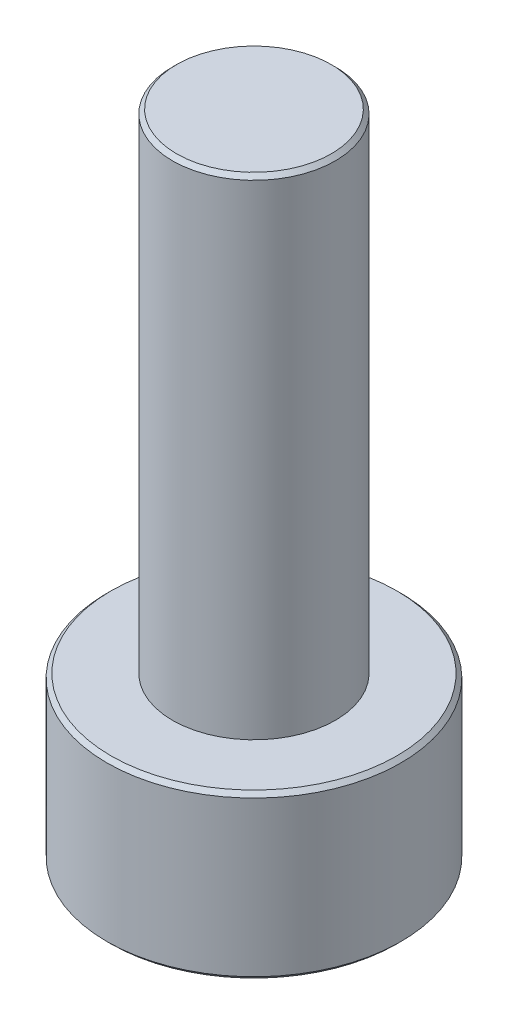
ISO-10303-21;
HEADER;
FILE_DESCRIPTION(('STEP AP214'),'2;1');
FILE_NAME('part.step','',(''),(''),'','','');
FILE_SCHEMA(('AUTOMOTIVE_DESIGN { 1 0 10303 214 1 1 1 1 }'));
ENDSEC;
DATA;
#1=APPLICATION_CONTEXT('core data for automotive mechanical design processes');
#2=APPLICATION_PROTOCOL_DEFINITION('international standard','automotive_design',2000,#1);
#3=PRODUCT_CONTEXT('',#1,'mechanical');
#4=PRODUCT('Part','Part','',(#3));
#5=PRODUCT_RELATED_PRODUCT_CATEGORY('part','',(#4));
#6=PRODUCT_DEFINITION_FORMATION('','',#4);
#7=PRODUCT_DEFINITION_CONTEXT('part definition',#1,'design');
#8=PRODUCT_DEFINITION('design','',#6,#7);
#9=PRODUCT_DEFINITION_SHAPE('','',#8);
#10=(LENGTH_UNIT() NAMED_UNIT(*) SI_UNIT(.MILLI.,.METRE.));
#11=(NAMED_UNIT(*) PLANE_ANGLE_UNIT() SI_UNIT($,.RADIAN.));
#12=(NAMED_UNIT(*) SI_UNIT($,.STERADIAN.) SOLID_ANGLE_UNIT());
#13=UNCERTAINTY_MEASURE_WITH_UNIT(LENGTH_MEASURE(1.E-05),#10,'distance_accuracy_value','');
#14=(GEOMETRIC_REPRESENTATION_CONTEXT(3) GLOBAL_UNCERTAINTY_ASSIGNED_CONTEXT((#13)) GLOBAL_UNIT_ASSIGNED_CONTEXT((#10,
#11,#12)) REPRESENTATION_CONTEXT('',''));
#15=CARTESIAN_POINT('',(0.,0.,0.));
#16=DIRECTION('',(0.,0.,1.));
#17=DIRECTION('',(1.,0.,0.));
#18=AXIS2_PLACEMENT_3D('',#15,#16,#17);
#19=CARTESIAN_POINT('',(0.,4.,0.));
#20=DIRECTION('',(0.,-1.,0.));
#21=DIRECTION('',(0.,0.,-1.));
#22=AXIS2_PLACEMENT_3D('',#19,#20,#21);
#23=CYLINDRICAL_SURFACE('',#22,3.61);
#24=CARTESIAN_POINT('',(0.,3.9,0.));
#25=DIRECTION('',(0.,1.,0.));
#26=DIRECTION('',(0.,0.,1.));
#27=AXIS2_PLACEMENT_3D('',#24,#25,#26);
#28=CIRCLE('',#27,3.61);
#29=CARTESIAN_POINT('',(0.,3.9,3.61));
#30=VERTEX_POINT('',#29);
#31=EDGE_CURVE('E44',#30,#30,#28,.F.);
#32=ORIENTED_EDGE('',*,*,#31,.T.);
#33=EDGE_LOOP('',(#32));
#34=FACE_BOUND('',#33,.T.);
#35=CARTESIAN_POINT('',(0.,0.0999999999999968,0.));
#36=DIRECTION('',(0.,1.,0.));
#37=DIRECTION('',(0.,0.,1.));
#38=AXIS2_PLACEMENT_3D('',#35,#36,#37);
#39=CIRCLE('',#38,3.61);
#40=CARTESIAN_POINT('',(0.,0.0999999999999968,3.61));
#41=VERTEX_POINT('',#40);
#42=EDGE_CURVE('E155',#41,#41,#39,.T.);
#43=ORIENTED_EDGE('',*,*,#42,.T.);
#44=EDGE_LOOP('',(#43));
#45=FACE_BOUND('',#44,.T.);
#46=ADVANCED_FACE('F36',(#34,#45),#23,.T.);
#47=CARTESIAN_POINT('',(0.,4.,0.));
#48=DIRECTION('',(0.,1.,0.));
#49=DIRECTION('',(0.,0.,1.));
#50=AXIS2_PLACEMENT_3D('',#47,#48,#49);
#51=PLANE('',#50);
#52=CARTESIAN_POINT('',(0.,4.,0.));
#53=DIRECTION('',(0.,1.,0.));
#54=DIRECTION('',(0.,0.,1.));
#55=AXIS2_PLACEMENT_3D('',#52,#53,#54);
#56=CIRCLE('',#55,3.51);
#57=CARTESIAN_POINT('',(0.,4.,3.51));
#58=VERTEX_POINT('',#57);
#59=EDGE_CURVE('E152',#58,#58,#56,.T.);
#60=ORIENTED_EDGE('',*,*,#59,.T.);
#61=EDGE_LOOP('',(#60));
#62=FACE_BOUND('',#61,.T.);
#63=CARTESIAN_POINT('',(0.,4.,0.));
#64=DIRECTION('',(0.,1.,0.));
#65=DIRECTION('',(0.,0.,1.));
#66=AXIS2_PLACEMENT_3D('',#63,#64,#65);
#67=CIRCLE('',#66,2.);
#68=CARTESIAN_POINT('',(0.,4.,2.));
#69=VERTEX_POINT('',#68);
#70=EDGE_CURVE('E138',#69,#69,#67,.T.);
#71=ORIENTED_EDGE('',*,*,#70,.F.);
#72=EDGE_LOOP('',(#71));
#73=FACE_BOUND('',#72,.T.);
#74=ADVANCED_FACE('F168',(#62,#73),#51,.T.);
#75=CARTESIAN_POINT('',(0.,0.,0.));
#76=DIRECTION('',(0.,1.,0.));
#77=DIRECTION('',(0.,0.,1.));
#78=AXIS2_PLACEMENT_3D('',#75,#76,#77);
#79=PLANE('',#78);
#80=CARTESIAN_POINT('',(0.,0.,0.));
#81=DIRECTION('',(0.,1.,0.));
#82=DIRECTION('',(0.,0.,1.));
#83=AXIS2_PLACEMENT_3D('',#80,#81,#82);
#84=CIRCLE('',#83,3.51);
#85=CARTESIAN_POINT('',(0.,0.,3.51));
#86=VERTEX_POINT('',#85);
#87=EDGE_CURVE('E11',#86,#86,#84,.F.);
#88=ORIENTED_EDGE('',*,*,#87,.T.);
#89=EDGE_LOOP('',(#88));
#90=FACE_BOUND('',#89,.T.);
#91=DIRECTION('',(0.,0.,1.));
#92=VECTOR('',#91,1.);
#93=CARTESIAN_POINT('',(1.54,0.,-0.889119414552024));
#94=LINE('',#93,#92);
#95=CARTESIAN_POINT('',(1.54,0.,-0.889119414552024));
#96=VERTEX_POINT('',#95);
#97=CARTESIAN_POINT('',(1.54,0.,0.889119414552024));
#98=VERTEX_POINT('',#97);
#99=EDGE_CURVE('E125',#96,#98,#94,.T.);
#100=ORIENTED_EDGE('',*,*,#99,.F.);
#101=DIRECTION('',(0.866025403784439,0.,0.5));
#102=VECTOR('',#101,1.);
#103=CARTESIAN_POINT('',(0.,0.,-1.77823882910405));
#104=LINE('',#103,#102);
#105=CARTESIAN_POINT('',(0.,0.,-1.77823882910405));
#106=VERTEX_POINT('',#105);
#107=EDGE_CURVE('E51',#106,#96,#104,.T.);
#108=ORIENTED_EDGE('',*,*,#107,.F.);
#109=DIRECTION('',(0.866025403784439,0.,-0.5));
#110=VECTOR('',#109,1.);
#111=CARTESIAN_POINT('',(-1.54,0.,-0.889119414552024));
#112=LINE('',#111,#110);
#113=CARTESIAN_POINT('',(-1.54,0.,-0.889119414552024));
#114=VERTEX_POINT('',#113);
#115=EDGE_CURVE('E134',#114,#106,#112,.T.);
#116=ORIENTED_EDGE('',*,*,#115,.F.);
#117=DIRECTION('',(0.,0.,-1.));
#118=VECTOR('',#117,1.);
#119=CARTESIAN_POINT('',(-1.54,0.,0.889119414552024));
#120=LINE('',#119,#118);
#121=CARTESIAN_POINT('',(-1.54,0.,0.889119414552024));
#122=VERTEX_POINT('',#121);
#123=EDGE_CURVE('E132',#122,#114,#120,.T.);
#124=ORIENTED_EDGE('',*,*,#123,.F.);
#125=DIRECTION('',(-0.866025403784439,0.,-0.5));
#126=VECTOR('',#125,1.);
#127=CARTESIAN_POINT('',(0.,0.,1.77823882910405));
#128=LINE('',#127,#126);
#129=CARTESIAN_POINT('',(0.,0.,1.77823882910405));
#130=VERTEX_POINT('',#129);
#131=EDGE_CURVE('E99',#130,#122,#128,.T.);
#132=ORIENTED_EDGE('',*,*,#131,.F.);
#133=DIRECTION('',(-0.866025403784439,0.,0.5));
#134=VECTOR('',#133,1.);
#135=CARTESIAN_POINT('',(1.54,0.,0.889119414552024));
#136=LINE('',#135,#134);
#137=EDGE_CURVE('E128',#98,#130,#136,.T.);
#138=ORIENTED_EDGE('',*,*,#137,.F.);
#139=EDGE_LOOP('',(#100,#108,#116,#124,#132,#138));
#140=FACE_BOUND('',#139,.T.);
#141=ADVANCED_FACE('F171',(#90,#140),#79,.F.);
#142=CARTESIAN_POINT('',(0.,16.,0.));
#143=DIRECTION('',(0.,-1.,0.));
#144=DIRECTION('',(0.,0.,-1.));
#145=AXIS2_PLACEMENT_3D('',#142,#143,#144);
#146=CYLINDRICAL_SURFACE('',#145,2.);
#147=CARTESIAN_POINT('',(0.,15.9,0.));
#148=DIRECTION('',(0.,1.,0.));
#149=DIRECTION('',(0.,0.,1.));
#150=AXIS2_PLACEMENT_3D('',#147,#148,#149);
#151=CIRCLE('',#150,2.);
#152=CARTESIAN_POINT('',(0.,15.9,2.));
#153=VERTEX_POINT('',#152);
#154=EDGE_CURVE('E149',#153,#153,#151,.F.);
#155=ORIENTED_EDGE('',*,*,#154,.T.);
#156=EDGE_LOOP('',(#155));
#157=FACE_BOUND('',#156,.T.);
#158=ORIENTED_EDGE('',*,*,#70,.T.);
#159=EDGE_LOOP('',(#158));
#160=FACE_BOUND('',#159,.T.);
#161=ADVANCED_FACE('F175',(#157,#160),#146,.T.);
#162=CARTESIAN_POINT('',(0.,16.,0.));
#163=DIRECTION('',(0.,1.,0.));
#164=DIRECTION('',(0.,0.,1.));
#165=AXIS2_PLACEMENT_3D('',#162,#163,#164);
#166=PLANE('',#165);
#167=CARTESIAN_POINT('',(0.,16.,0.));
#168=DIRECTION('',(0.,1.,0.));
#169=DIRECTION('',(0.,0.,1.));
#170=AXIS2_PLACEMENT_3D('',#167,#168,#169);
#171=CIRCLE('',#170,1.9);
#172=CARTESIAN_POINT('',(0.,16.,1.9));
#173=VERTEX_POINT('',#172);
#174=EDGE_CURVE('E146',#173,#173,#171,.T.);
#175=ORIENTED_EDGE('',*,*,#174,.T.);
#176=EDGE_LOOP('',(#175));
#177=FACE_BOUND('',#176,.T.);
#178=ADVANCED_FACE('F177',(#177),#166,.T.);
#179=CARTESIAN_POINT('',(0.,2.,-1.77823882910405));
#180=DIRECTION('',(0.5,0.,-0.866025403784439));
#181=DIRECTION('',(-0.866025403784439,0.,-0.5));
#182=AXIS2_PLACEMENT_3D('',#179,#180,#181);
#183=PLANE('',#182);
#184=ORIENTED_EDGE('',*,*,#107,.T.);
#185=DIRECTION('',(0.,-1.,0.));
#186=VECTOR('',#185,1.);
#187=CARTESIAN_POINT('',(1.54,2.,-0.889119414552024));
#188=LINE('',#187,#186);
#189=CARTESIAN_POINT('',(1.54,2.,-0.889119414552024));
#190=VERTEX_POINT('',#189);
#191=EDGE_CURVE('E81',#190,#96,#188,.T.);
#192=ORIENTED_EDGE('',*,*,#191,.F.);
#193=DIRECTION('',(0.866025403784439,0.,0.5));
#194=VECTOR('',#193,1.);
#195=CARTESIAN_POINT('',(0.,2.,-1.77823882910405));
#196=LINE('',#195,#194);
#197=CARTESIAN_POINT('',(0.,2.,-1.77823882910405));
#198=VERTEX_POINT('',#197);
#199=EDGE_CURVE('E136',#198,#190,#196,.T.);
#200=ORIENTED_EDGE('',*,*,#199,.F.);
#201=DIRECTION('',(0.,-1.,0.));
#202=VECTOR('',#201,1.);
#203=CARTESIAN_POINT('',(0.,2.,-1.77823882910405));
#204=LINE('',#203,#202);
#205=EDGE_CURVE('E59',#198,#106,#204,.T.);
#206=ORIENTED_EDGE('',*,*,#205,.T.);
#207=EDGE_LOOP('',(#184,#192,#200,#206));
#208=FACE_BOUND('',#207,.T.);
#209=ADVANCED_FACE('F184',(#208),#183,.F.);
#210=CARTESIAN_POINT('',(-1.54,2.,-0.889119414552024));
#211=DIRECTION('',(-0.5,0.,-0.866025403784439));
#212=DIRECTION('',(-0.866025403784439,0.,0.5));
#213=AXIS2_PLACEMENT_3D('',#210,#211,#212);
#214=PLANE('',#213);
#215=ORIENTED_EDGE('',*,*,#115,.T.);
#216=ORIENTED_EDGE('',*,*,#205,.F.);
#217=DIRECTION('',(0.866025403784439,0.,-0.5));
#218=VECTOR('',#217,1.);
#219=CARTESIAN_POINT('',(-1.54,2.,-0.889119414552024));
#220=LINE('',#219,#218);
#221=CARTESIAN_POINT('',(-1.54,2.,-0.889119414552024));
#222=VERTEX_POINT('',#221);
#223=EDGE_CURVE('E111',#222,#198,#220,.T.);
#224=ORIENTED_EDGE('',*,*,#223,.F.);
#225=DIRECTION('',(0.,-1.,0.));
#226=VECTOR('',#225,1.);
#227=CARTESIAN_POINT('',(-1.54,2.,-0.889119414552024));
#228=LINE('',#227,#226);
#229=EDGE_CURVE('E103',#222,#114,#228,.T.);
#230=ORIENTED_EDGE('',*,*,#229,.T.);
#231=EDGE_LOOP('',(#215,#216,#224,#230));
#232=FACE_BOUND('',#231,.T.);
#233=ADVANCED_FACE('F211',(#232),#214,.F.);
#234=CARTESIAN_POINT('',(-1.54,2.,0.889119414552024));
#235=DIRECTION('',(-1.,0.,0.));
#236=DIRECTION('',(0.,0.,1.));
#237=AXIS2_PLACEMENT_3D('',#234,#235,#236);
#238=PLANE('',#237);
#239=ORIENTED_EDGE('',*,*,#123,.T.);
#240=ORIENTED_EDGE('',*,*,#229,.F.);
#241=DIRECTION('',(0.,0.,-1.));
#242=VECTOR('',#241,1.);
#243=CARTESIAN_POINT('',(-1.54,2.,0.889119414552024));
#244=LINE('',#243,#242);
#245=CARTESIAN_POINT('',(-1.54,2.,0.889119414552024));
#246=VERTEX_POINT('',#245);
#247=EDGE_CURVE('E107',#246,#222,#244,.T.);
#248=ORIENTED_EDGE('',*,*,#247,.F.);
#249=DIRECTION('',(0.,-1.,0.));
#250=VECTOR('',#249,1.);
#251=CARTESIAN_POINT('',(-1.54,2.,0.889119414552024));
#252=LINE('',#251,#250);
#253=EDGE_CURVE('E92',#246,#122,#252,.T.);
#254=ORIENTED_EDGE('',*,*,#253,.T.);
#255=EDGE_LOOP('',(#239,#240,#248,#254));
#256=FACE_BOUND('',#255,.T.);
#257=ADVANCED_FACE('F108',(#256),#238,.F.);
#258=CARTESIAN_POINT('',(0.,2.,1.77823882910405));
#259=DIRECTION('',(-0.5,0.,0.866025403784439));
#260=DIRECTION('',(0.866025403784439,0.,0.5));
#261=AXIS2_PLACEMENT_3D('',#258,#259,#260);
#262=PLANE('',#261);
#263=ORIENTED_EDGE('',*,*,#131,.T.);
#264=ORIENTED_EDGE('',*,*,#253,.F.);
#265=DIRECTION('',(-0.866025403784439,0.,-0.5));
#266=VECTOR('',#265,1.);
#267=CARTESIAN_POINT('',(0.,2.,1.77823882910405));
#268=LINE('',#267,#266);
#269=CARTESIAN_POINT('',(0.,2.,1.77823882910405));
#270=VERTEX_POINT('',#269);
#271=EDGE_CURVE('E96',#270,#246,#268,.T.);
#272=ORIENTED_EDGE('',*,*,#271,.F.);
#273=DIRECTION('',(0.,-1.,0.));
#274=VECTOR('',#273,1.);
#275=CARTESIAN_POINT('',(0.,2.,1.77823882910405));
#276=LINE('',#275,#274);
#277=EDGE_CURVE('E104',#270,#130,#276,.T.);
#278=ORIENTED_EDGE('',*,*,#277,.T.);
#279=EDGE_LOOP('',(#263,#264,#272,#278));
#280=FACE_BOUND('',#279,.T.);
#281=ADVANCED_FACE('F94',(#280),#262,.F.);
#282=CARTESIAN_POINT('',(1.54,2.,0.889119414552024));
#283=DIRECTION('',(0.5,0.,0.866025403784439));
#284=DIRECTION('',(0.866025403784439,0.,-0.5));
#285=AXIS2_PLACEMENT_3D('',#282,#283,#284);
#286=PLANE('',#285);
#287=ORIENTED_EDGE('',*,*,#137,.T.);
#288=ORIENTED_EDGE('',*,*,#277,.F.);
#289=DIRECTION('',(-0.866025403784439,0.,0.5));
#290=VECTOR('',#289,1.);
#291=CARTESIAN_POINT('',(1.54,2.,0.889119414552024));
#292=LINE('',#291,#290);
#293=CARTESIAN_POINT('',(1.54,2.,0.889119414552024));
#294=VERTEX_POINT('',#293);
#295=EDGE_CURVE('E117',#294,#270,#292,.T.);
#296=ORIENTED_EDGE('',*,*,#295,.F.);
#297=DIRECTION('',(0.,-1.,0.));
#298=VECTOR('',#297,1.);
#299=CARTESIAN_POINT('',(1.54,2.,0.889119414552024));
#300=LINE('',#299,#298);
#301=EDGE_CURVE('E141',#294,#98,#300,.T.);
#302=ORIENTED_EDGE('',*,*,#301,.T.);
#303=EDGE_LOOP('',(#287,#288,#296,#302));
#304=FACE_BOUND('',#303,.T.);
#305=ADVANCED_FACE('F207',(#304),#286,.F.);
#306=CARTESIAN_POINT('',(1.54,2.,-0.889119414552024));
#307=DIRECTION('',(1.,0.,0.));
#308=DIRECTION('',(0.,0.,-1.));
#309=AXIS2_PLACEMENT_3D('',#306,#307,#308);
#310=PLANE('',#309);
#311=ORIENTED_EDGE('',*,*,#99,.T.);
#312=ORIENTED_EDGE('',*,*,#301,.F.);
#313=DIRECTION('',(0.,0.,1.));
#314=VECTOR('',#313,1.);
#315=CARTESIAN_POINT('',(1.54,2.,-0.889119414552024));
#316=LINE('',#315,#314);
#317=EDGE_CURVE('E119',#190,#294,#316,.T.);
#318=ORIENTED_EDGE('',*,*,#317,.F.);
#319=ORIENTED_EDGE('',*,*,#191,.T.);
#320=EDGE_LOOP('',(#311,#312,#318,#319));
#321=FACE_BOUND('',#320,.T.);
#322=ADVANCED_FACE('F199',(#321),#310,.F.);
#323=CARTESIAN_POINT('',(0.,2.,0.));
#324=DIRECTION('',(0.,-1.,0.));
#325=DIRECTION('',(0.,0.,-1.));
#326=AXIS2_PLACEMENT_3D('',#323,#324,#325);
#327=PLANE('',#326);
#328=ORIENTED_EDGE('',*,*,#199,.T.);
#329=ORIENTED_EDGE('',*,*,#317,.T.);
#330=ORIENTED_EDGE('',*,*,#295,.T.);
#331=ORIENTED_EDGE('',*,*,#271,.T.);
#332=ORIENTED_EDGE('',*,*,#247,.T.);
#333=ORIENTED_EDGE('',*,*,#223,.T.);
#334=EDGE_LOOP('',(#328,#329,#330,#331,#332,#333));
#335=FACE_BOUND('',#334,.T.);
#336=ADVANCED_FACE('F114',(#335),#327,.T.);
#337=CARTESIAN_POINT('',(0.,16.,0.));
#338=DIRECTION('',(0.,-1.,0.));
#339=DIRECTION('',(0.,0.,-1.));
#340=AXIS2_PLACEMENT_3D('',#337,#338,#339);
#341=CONICAL_SURFACE('',#340,1.9,0.785398163397457);
#342=ORIENTED_EDGE('',*,*,#154,.F.);
#343=EDGE_LOOP('',(#342));
#344=FACE_BOUND('',#343,.T.);
#345=ORIENTED_EDGE('',*,*,#174,.F.);
#346=EDGE_LOOP('',(#345));
#347=FACE_BOUND('',#346,.T.);
#348=ADVANCED_FACE('F165',(#344,#347),#341,.T.);
#349=CARTESIAN_POINT('',(0.,4.,0.));
#350=DIRECTION('',(0.,-1.,0.));
#351=DIRECTION('',(0.,0.,-1.));
#352=AXIS2_PLACEMENT_3D('',#349,#350,#351);
#353=CONICAL_SURFACE('',#352,3.51,0.785398163397448);
#354=ORIENTED_EDGE('',*,*,#31,.F.);
#355=EDGE_LOOP('',(#354));
#356=FACE_BOUND('',#355,.T.);
#357=ORIENTED_EDGE('',*,*,#59,.F.);
#358=EDGE_LOOP('',(#357));
#359=FACE_BOUND('',#358,.T.);
#360=ADVANCED_FACE('F162',(#356,#359),#353,.T.);
#361=CARTESIAN_POINT('',(0.,0.0999999999999968,0.));
#362=DIRECTION('',(0.,1.,0.));
#363=DIRECTION('',(0.,0.,1.));
#364=AXIS2_PLACEMENT_3D('',#361,#362,#363);
#365=CONICAL_SURFACE('',#364,3.61,0.785398163397459);
#366=CARTESIAN_POINT('',(0.,0.,3.51));
#367=CARTESIAN_POINT('',(0.,0.00104166666666651,3.51104166666667));
#368=CARTESIAN_POINT('',(0.,0.00208333333333318,3.51208333333333));
#369=CARTESIAN_POINT('',(0.,0.00416666666666652,3.51416666666667));
#370=CARTESIAN_POINT('',(0.,0.00520833333333319,3.51520833333333));
#371=CARTESIAN_POINT('',(0.,0.00729166666666646,3.51729166666667));
#372=CARTESIAN_POINT('',(0.,0.00833333333333306,3.51833333333333));
#373=CARTESIAN_POINT('',(0.,0.0104166666666663,3.52041666666667));
#374=CARTESIAN_POINT('',(0.,0.011458333333333,3.52145833333333));
#375=CARTESIAN_POINT('',(0.,0.0135416666666662,3.52354166666667));
#376=CARTESIAN_POINT('',(0.,0.0145833333333328,3.52458333333333));
#377=CARTESIAN_POINT('',(0.,0.0166666666666661,3.52666666666667));
#378=CARTESIAN_POINT('',(0.,0.0177083333333328,3.52770833333333));
#379=CARTESIAN_POINT('',(0.,0.0197916666666661,3.52979166666667));
#380=CARTESIAN_POINT('',(0.,0.0208333333333327,3.53083333333333));
#381=CARTESIAN_POINT('',(0.,0.0229166666666659,3.53291666666667));
#382=CARTESIAN_POINT('',(0.,0.0239583333333325,3.53395833333333));
#383=CARTESIAN_POINT('',(0.,0.0260416666666658,3.53604166666667));
#384=CARTESIAN_POINT('',(0.,0.0270833333333325,3.53708333333333));
#385=CARTESIAN_POINT('',(0.,0.0291666666666658,3.53916666666667));
#386=CARTESIAN_POINT('',(0.,0.0302083333333324,3.54020833333333));
#387=CARTESIAN_POINT('',(0.,0.0322916666666656,3.54229166666667));
#388=CARTESIAN_POINT('',(0.,0.0333333333333323,3.54333333333333));
#389=CARTESIAN_POINT('',(0.,0.0354166666666655,3.54541666666667));
#390=CARTESIAN_POINT('',(0.,0.0364583333333321,3.54645833333333));
#391=CARTESIAN_POINT('',(0.,0.0385416666666654,3.54854166666667));
#392=CARTESIAN_POINT('',(0.,0.0395833333333321,3.54958333333333));
#393=CARTESIAN_POINT('',(0.,0.0416666666666654,3.55166666666667));
#394=CARTESIAN_POINT('',(0.,0.042708333333332,3.55270833333333));
#395=CARTESIAN_POINT('',(0.,0.0447916666666652,3.55479166666667));
#396=CARTESIAN_POINT('',(0.,0.0458333333333318,3.55583333333333));
#397=CARTESIAN_POINT('',(0.,0.0479166666666651,3.55791666666667));
#398=CARTESIAN_POINT('',(0.,0.0489583333333318,3.55895833333333));
#399=CARTESIAN_POINT('',(0.,0.0510416666666651,3.56104166666667));
#400=CARTESIAN_POINT('',(0.,0.0520833333333317,3.56208333333333));
#401=CARTESIAN_POINT('',(0.,0.0541666666666649,3.56416666666667));
#402=CARTESIAN_POINT('',(0.,0.0552083333333316,3.56520833333333));
#403=CARTESIAN_POINT('',(0.,0.0572916666666648,3.56729166666667));
#404=CARTESIAN_POINT('',(0.,0.0583333333333314,3.56833333333333));
#405=CARTESIAN_POINT('',(0.,0.0604166666666647,3.57041666666667));
#406=CARTESIAN_POINT('',(0.,0.0614583333333314,3.57145833333333));
#407=CARTESIAN_POINT('',(0.,0.0635416666666647,3.57354166666667));
#408=CARTESIAN_POINT('',(0.,0.0645833333333313,3.57458333333333));
#409=CARTESIAN_POINT('',(0.,0.0666666666666645,3.57666666666667));
#410=CARTESIAN_POINT('',(0.,0.0677083333333311,3.57770833333333));
#411=CARTESIAN_POINT('',(0.,0.0697916666666644,3.57979166666667));
#412=CARTESIAN_POINT('',(0.,0.0708333333333311,3.58083333333333));
#413=CARTESIAN_POINT('',(0.,0.0729166666666644,3.58291666666667));
#414=CARTESIAN_POINT('',(0.,0.073958333333331,3.58395833333333));
#415=CARTESIAN_POINT('',(0.,0.0760416666666642,3.58604166666667));
#416=CARTESIAN_POINT('',(0.,0.0770833333333309,3.58708333333333));
#417=CARTESIAN_POINT('',(0.,0.0791666666666641,3.58916666666667));
#418=CARTESIAN_POINT('',(0.,0.0802083333333307,3.59020833333333));
#419=CARTESIAN_POINT('',(0.,0.082291666666664,3.59229166666667));
#420=CARTESIAN_POINT('',(0.,0.0833333333333307,3.59333333333333));
#421=CARTESIAN_POINT('',(0.,0.0854166666666639,3.59541666666667));
#422=CARTESIAN_POINT('',(0.,0.0864583333333306,3.59645833333333));
#423=CARTESIAN_POINT('',(0.,0.0885416666666638,3.59854166666667));
#424=CARTESIAN_POINT('',(0.,0.0895833333333305,3.59958333333333));
#425=CARTESIAN_POINT('',(0.,0.0916666666666637,3.60166666666667));
#426=CARTESIAN_POINT('',(0.,0.0927083333333303,3.60270833333333));
#427=CARTESIAN_POINT('',(0.,0.0947916666666636,3.60479166666667));
#428=CARTESIAN_POINT('',(0.,0.0958333333333302,3.60583333333333));
#429=CARTESIAN_POINT('',(0.,0.0979166666666636,3.60791666666667));
#430=CARTESIAN_POINT('',(0.,0.0989583333333302,3.60895833333333));
#431=CARTESIAN_POINT('',(0.,0.0999999999999968,3.61));
#432=B_SPLINE_CURVE_WITH_KNOTS('',3,(#366,#367,#368,#369,#370,#371,#372,#373,#374,#375,#376,
#377,#378,#379,#380,#381,#382,#383,#384,#385,#386,#387,#388,#389,#390,#391,#392,#393,#394,#395,
#396,#397,#398,#399,#400,#401,#402,#403,#404,#405,#406,#407,#408,#409,#410,#411,#412,#413,#414,
#415,#416,#417,#418,#419,#420,#421,#422,#423,#424,#425,#426,#427,#428,#429,#430,#431),
.UNSPECIFIED.,.F.,.F.,(4,2,2,2,2,2,2,2,2,2,2,2,2,2,2,2,2,2,2,2,2,2,2,2,2,2,2,2,2,2,2,2,4),(0.,
0.00441941738241591,0.00883883476483152,0.0132582521472474,0.0176776695296634,
0.0220970869120793,0.0265165042944949,0.0309359216769108,0.0353553390593267,0.0397747564417423,
0.0441941738241582,0.0486135912065741,0.0530330085889901,0.0574524259714057,0.0618718433538216,
0.0662912607362375,0.0707106781186531,0.075130095501069,0.0795495128834849,0.0839689302659008,
0.0883883476483165,0.0928077650307324,0.0972271824131483,0.101646599795564,0.10606601717798,
0.110485434560396,0.114904851942812,0.119324269325227,0.123743686707643,0.128163104090059,
0.132582521472475,0.137001938854891,0.141421356237307),.UNSPECIFIED.);
#433=EDGE_CURVE('BSEAM38',#86,#41,#432,.T.);
#434=ORIENTED_EDGE('',*,*,#87,.F.);
#435=ORIENTED_EDGE('',*,*,#42,.F.);
#436=ORIENTED_EDGE('',*,*,#433,.T.);
#437=ORIENTED_EDGE('',*,*,#433,.F.);
#438=EDGE_LOOP('',(#434,#436,#435,#437));
#439=FACE_BOUND('',#438,.T.);
#440=ADVANCED_FACE('F38',(#439),#365,.T.);
#441=CLOSED_SHELL('',(#46,#74,#141,#161,#178,#209,#233,#257,#281,#305,#322,#336,#348,#360,#440));
#442=MANIFOLD_SOLID_BREP('B2',#441);
#443=ADVANCED_BREP_SHAPE_REPRESENTATION('',(#18,#442),#14);
#444=SHAPE_DEFINITION_REPRESENTATION(#9,#443);
ENDSEC;
END-ISO-10303-21;
